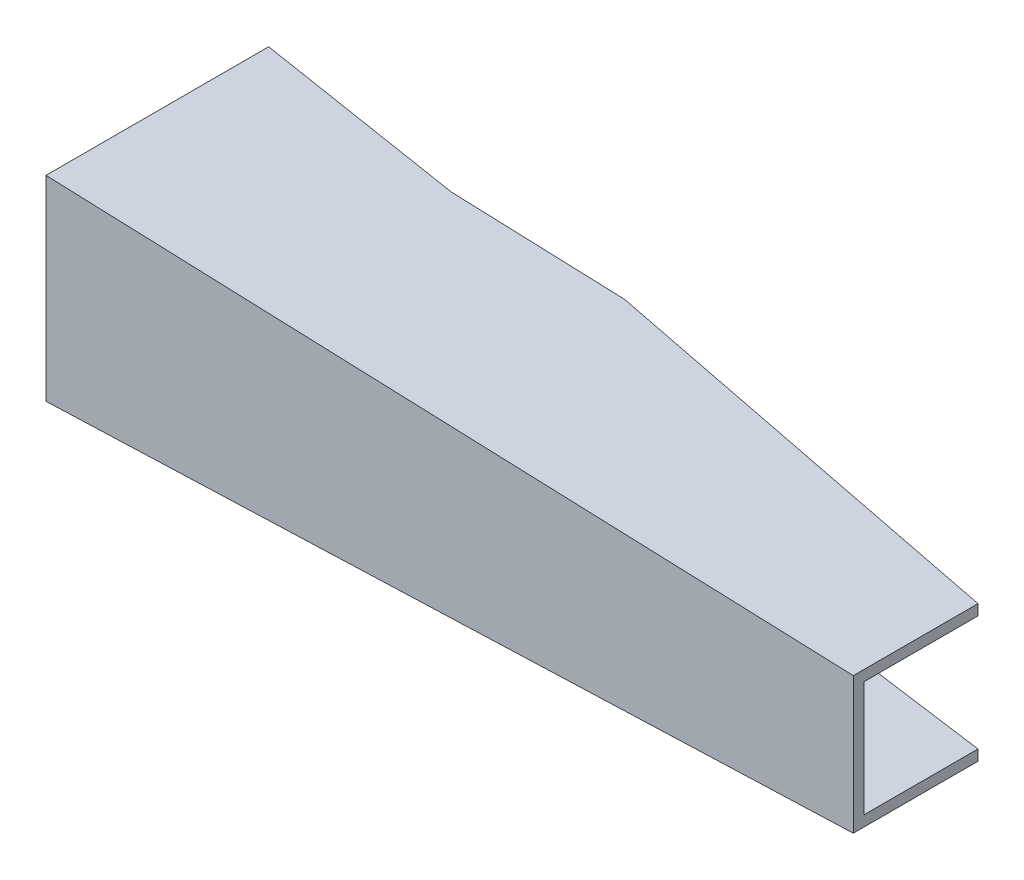
ISO-10303-21;
HEADER;
FILE_DESCRIPTION(('STEP AP214'),'2;1');
FILE_NAME('part.step','',(''),(''),'','','');
FILE_SCHEMA(('AUTOMOTIVE_DESIGN { 1 0 10303 214 1 1 1 1 }'));
ENDSEC;
DATA;
#1=APPLICATION_CONTEXT('core data for automotive mechanical design processes');
#2=APPLICATION_PROTOCOL_DEFINITION('international standard','automotive_design',2000,#1);
#3=PRODUCT_CONTEXT('',#1,'mechanical');
#4=PRODUCT('Part','Part','',(#3));
#5=PRODUCT_RELATED_PRODUCT_CATEGORY('part','',(#4));
#6=PRODUCT_DEFINITION_FORMATION('','',#4);
#7=PRODUCT_DEFINITION_CONTEXT('part definition',#1,'design');
#8=PRODUCT_DEFINITION('design','',#6,#7);
#9=PRODUCT_DEFINITION_SHAPE('','',#8);
#10=(LENGTH_UNIT() NAMED_UNIT(*) SI_UNIT(.MILLI.,.METRE.));
#11=(NAMED_UNIT(*) PLANE_ANGLE_UNIT() SI_UNIT($,.RADIAN.));
#12=(NAMED_UNIT(*) SI_UNIT($,.STERADIAN.) SOLID_ANGLE_UNIT());
#13=UNCERTAINTY_MEASURE_WITH_UNIT(LENGTH_MEASURE(1.E-05),#10,'distance_accuracy_value','');
#14=(GEOMETRIC_REPRESENTATION_CONTEXT(3) GLOBAL_UNCERTAINTY_ASSIGNED_CONTEXT((#13)) GLOBAL_UNIT_ASSIGNED_CONTEXT((#10,
#11,#12)) REPRESENTATION_CONTEXT('',''));
#15=CARTESIAN_POINT('',(0.,0.,0.));
#16=DIRECTION('',(0.,0.,1.));
#17=DIRECTION('',(1.,0.,0.));
#18=AXIS2_PLACEMENT_3D('',#15,#16,#17);
#19=CARTESIAN_POINT('',(326.3,-27.585,105.));
#20=DIRECTION('',(-1.,0.,0.));
#21=DIRECTION('',(0.,0.,1.));
#22=AXIS2_PLACEMENT_3D('',#19,#20,#21);
#23=PLANE('',#22);
#24=DIRECTION('',(0.,0.,1.));
#25=VECTOR('',#24,1.);
#26=CARTESIAN_POINT('',(326.3,23.285,100.7));
#27=LINE('',#26,#25);
#28=CARTESIAN_POINT('',(326.3,23.285,54.6));
#29=VERTEX_POINT('',#28);
#30=CARTESIAN_POINT('',(326.3,23.285,100.7));
#31=VERTEX_POINT('',#30);
#32=EDGE_CURVE('E138',#29,#31,#27,.T.);
#33=ORIENTED_EDGE('',*,*,#32,.F.);
#34=DIRECTION('',(0.,-1.,0.));
#35=VECTOR('',#34,1.);
#36=CARTESIAN_POINT('',(326.3,105.1,54.6));
#37=LINE('',#36,#35);
#38=CARTESIAN_POINT('',(326.3,27.585,54.6));
#39=VERTEX_POINT('',#38);
#40=EDGE_CURVE('E244',#39,#29,#37,.T.);
#41=ORIENTED_EDGE('',*,*,#40,.F.);
#42=DIRECTION('',(0.,0.,-1.));
#43=VECTOR('',#42,1.);
#44=CARTESIAN_POINT('',(326.3,27.585,105.));
#45=LINE('',#44,#43);
#46=CARTESIAN_POINT('',(326.3,27.585,105.));
#47=VERTEX_POINT('',#46);
#48=EDGE_CURVE('E229',#47,#39,#45,.T.);
#49=ORIENTED_EDGE('',*,*,#48,.F.);
#50=DIRECTION('',(0.,1.,0.));
#51=VECTOR('',#50,1.);
#52=CARTESIAN_POINT('',(326.3,-27.585,105.));
#53=LINE('',#52,#51);
#54=CARTESIAN_POINT('',(326.3,-27.585,105.));
#55=VERTEX_POINT('',#54);
#56=EDGE_CURVE('E204',#55,#47,#53,.T.);
#57=ORIENTED_EDGE('',*,*,#56,.F.);
#58=DIRECTION('',(0.,0.,-1.));
#59=VECTOR('',#58,1.);
#60=CARTESIAN_POINT('',(326.3,-27.585,105.));
#61=LINE('',#60,#59);
#62=CARTESIAN_POINT('',(326.3,-27.585,54.6));
#63=VERTEX_POINT('',#62);
#64=EDGE_CURVE('E217',#55,#63,#61,.T.);
#65=ORIENTED_EDGE('',*,*,#64,.T.);
#66=CARTESIAN_POINT('',(326.3,-23.285,54.6));
#67=VERTEX_POINT('',#66);
#68=EDGE_CURVE('E71',#67,#63,#37,.T.);
#69=ORIENTED_EDGE('',*,*,#68,.F.);
#70=DIRECTION('',(0.,0.,-1.));
#71=VECTOR('',#70,1.);
#72=CARTESIAN_POINT('',(326.3,-23.285,100.7));
#73=LINE('',#72,#71);
#74=CARTESIAN_POINT('',(326.3,-23.285,100.7));
#75=VERTEX_POINT('',#74);
#76=EDGE_CURVE('E64',#75,#67,#73,.T.);
#77=ORIENTED_EDGE('',*,*,#76,.F.);
#78=DIRECTION('',(0.,-1.,0.));
#79=VECTOR('',#78,1.);
#80=CARTESIAN_POINT('',(326.3,23.285,100.7));
#81=LINE('',#80,#79);
#82=EDGE_CURVE('E152',#31,#75,#81,.T.);
#83=ORIENTED_EDGE('',*,*,#82,.F.);
#84=EDGE_LOOP('',(#33,#41,#49,#57,#65,#69,#77,#83));
#85=FACE_BOUND('',#84,.T.);
#86=ADVANCED_FACE('F47',(#85),#23,.F.);
#87=CARTESIAN_POINT('',(0.,39.555,105.));
#88=DIRECTION('',(1.,0.,0.));
#89=DIRECTION('',(0.,1.,0.));
#90=AXIS2_PLACEMENT_3D('',#87,#88,#89);
#91=PLANE('',#90);
#92=DIRECTION('',(0.,0.,-1.));
#93=VECTOR('',#92,1.);
#94=CARTESIAN_POINT('',(0.,35.255,-10.9565275072));
#95=LINE('',#94,#93);
#96=CARTESIAN_POINT('',(0.,35.255,100.7));
#97=VERTEX_POINT('',#96);
#98=CARTESIAN_POINT('',(0.,35.255,15.));
#99=VERTEX_POINT('',#98);
#100=EDGE_CURVE('E170',#97,#99,#95,.T.);
#101=ORIENTED_EDGE('',*,*,#100,.F.);
#102=DIRECTION('',(0.,1.,0.));
#103=VECTOR('',#102,1.);
#104=CARTESIAN_POINT('',(0.,35.255,100.7));
#105=LINE('',#104,#103);
#106=CARTESIAN_POINT('',(0.,-35.255,100.7));
#107=VERTEX_POINT('',#106);
#108=EDGE_CURVE('E154',#107,#97,#105,.T.);
#109=ORIENTED_EDGE('',*,*,#108,.F.);
#110=DIRECTION('',(0.,0.,1.));
#111=VECTOR('',#110,1.);
#112=CARTESIAN_POINT('',(0.,-35.255,-10.9565275072));
#113=LINE('',#112,#111);
#114=CARTESIAN_POINT('',(0.,-35.255,15.));
#115=VERTEX_POINT('',#114);
#116=EDGE_CURVE('E178',#115,#107,#113,.T.);
#117=ORIENTED_EDGE('',*,*,#116,.F.);
#118=DIRECTION('',(0.,-1.,0.));
#119=VECTOR('',#118,1.);
#120=CARTESIAN_POINT('',(0.,105.1,15.));
#121=LINE('',#120,#119);
#122=CARTESIAN_POINT('',(0.,-39.555,15.));
#123=VERTEX_POINT('',#122);
#124=EDGE_CURVE('E183',#115,#123,#121,.T.);
#125=ORIENTED_EDGE('',*,*,#124,.T.);
#126=DIRECTION('',(0.,0.,-1.));
#127=VECTOR('',#126,1.);
#128=CARTESIAN_POINT('',(0.,-39.555,105.));
#129=LINE('',#128,#127);
#130=CARTESIAN_POINT('',(0.,-39.555,105.));
#131=VERTEX_POINT('',#130);
#132=EDGE_CURVE('E221',#131,#123,#129,.T.);
#133=ORIENTED_EDGE('',*,*,#132,.F.);
#134=DIRECTION('',(0.,-1.,0.));
#135=VECTOR('',#134,1.);
#136=CARTESIAN_POINT('',(0.,39.555,105.));
#137=LINE('',#136,#135);
#138=CARTESIAN_POINT('',(0.,39.555,105.));
#139=VERTEX_POINT('',#138);
#140=EDGE_CURVE('E211',#139,#131,#137,.T.);
#141=ORIENTED_EDGE('',*,*,#140,.F.);
#142=DIRECTION('',(0.,0.,-1.));
#143=VECTOR('',#142,1.);
#144=CARTESIAN_POINT('',(0.,39.555,105.));
#145=LINE('',#144,#143);
#146=CARTESIAN_POINT('',(0.,39.555,15.));
#147=VERTEX_POINT('',#146);
#148=EDGE_CURVE('E225',#139,#147,#145,.T.);
#149=ORIENTED_EDGE('',*,*,#148,.T.);
#150=EDGE_CURVE('E187',#147,#99,#121,.T.);
#151=ORIENTED_EDGE('',*,*,#150,.T.);
#152=EDGE_LOOP('',(#101,#109,#117,#125,#133,#141,#149,#151));
#153=FACE_BOUND('',#152,.T.);
#154=ADVANCED_FACE('F304',(#153),#91,.F.);
#155=CARTESIAN_POINT('',(0.,105.1,15.));
#156=DIRECTION('',(0.126715247143414,0.,-0.991939134292716));
#157=DIRECTION('',(-0.991939134292716,0.,-0.126715247143414));
#158=AXIS2_PLACEMENT_3D('',#155,#156,#157);
#159=PLANE('',#158);
#160=DIRECTION('',(0.,-1.,0.));
#161=VECTOR('',#160,1.);
#162=CARTESIAN_POINT('',(84.7,105.1,25.82));
#163=LINE('',#162,#161);
#164=CARTESIAN_POINT('',(84.7,36.4478623965676,25.82));
#165=VERTEX_POINT('',#164);
#166=CARTESIAN_POINT('',(84.7,32.1478623965676,25.82));
#167=VERTEX_POINT('',#166);
#168=EDGE_CURVE('E188',#165,#167,#163,.T.);
#169=ORIENTED_EDGE('',*,*,#168,.T.);
#170=DIRECTION('',(-0.991283067279321,0.036364260849934,-0.126631437874407));
#171=VECTOR('',#170,1.);
#172=CARTESIAN_POINT('',(-2.51772199464138,35.3473601969839,14.6783736483823));
#173=LINE('',#172,#171);
#174=EDGE_CURVE('E288',#167,#99,#173,.T.);
#175=ORIENTED_EDGE('',*,*,#174,.T.);
#176=ORIENTED_EDGE('',*,*,#150,.F.);
#177=DIRECTION('',(0.991283067279321,-0.036364260849934,0.126631437874407));
#178=VECTOR('',#177,1.);
#179=CARTESIAN_POINT('',(332.365093492241,27.3625079095859,57.4579729821257));
#180=LINE('',#179,#178);
#181=EDGE_CURVE('E201',#147,#165,#180,.T.);
#182=ORIENTED_EDGE('',*,*,#181,.T.);
#183=EDGE_LOOP('',(#169,#175,#176,#182));
#184=FACE_BOUND('',#183,.T.);
#185=ADVANCED_FACE('F300',(#184),#159,.T.);
#186=ORIENTED_EDGE('',*,*,#124,.F.);
#187=DIRECTION('',(0.991283067279321,0.036364260849934,0.126631437874407));
#188=VECTOR('',#187,1.);
#189=CARTESIAN_POINT('',(5.05941542784582,-35.0694002369865,15.6463149342301));
#190=LINE('',#189,#188);
#191=CARTESIAN_POINT('',(84.7,-32.1478623965676,25.82));
#192=VERTEX_POINT('',#191);
#193=EDGE_CURVE('E281',#115,#192,#190,.T.);
#194=ORIENTED_EDGE('',*,*,#193,.T.);
#195=CARTESIAN_POINT('',(84.7,-36.4478623965676,25.82));
#196=VERTEX_POINT('',#195);
#197=EDGE_CURVE('E258',#192,#196,#163,.T.);
#198=ORIENTED_EDGE('',*,*,#197,.T.);
#199=DIRECTION('',(-0.991283067279321,-0.036364260849934,-0.126631437874407));
#200=VECTOR('',#199,1.);
#201=CARTESIAN_POINT('',(11.297484013512,-39.14056272252,16.4431968952326));
#202=LINE('',#201,#200);
#203=EDGE_CURVE('E240',#196,#123,#202,.T.);
#204=ORIENTED_EDGE('',*,*,#203,.T.);
#205=EDGE_LOOP('',(#186,#194,#198,#204));
#206=FACE_BOUND('',#205,.T.);
#207=ADVANCED_FACE('F279',(#206),#159,.T.);
#208=CARTESIAN_POINT('',(84.7,105.1,25.82));
#209=DIRECTION('',(0.,0.,-1.));
#210=DIRECTION('',(-1.,0.,0.));
#211=AXIS2_PLACEMENT_3D('',#208,#209,#210);
#212=PLANE('',#211);
#213=DIRECTION('',(0.,-1.,0.));
#214=VECTOR('',#213,1.);
#215=CARTESIAN_POINT('',(154.7,105.1,25.82));
#216=LINE('',#215,#214);
#217=CARTESIAN_POINT('',(154.7,33.8799800796813,25.82));
#218=VERTEX_POINT('',#217);
#219=CARTESIAN_POINT('',(154.7,29.5799800796813,25.82));
#220=VERTEX_POINT('',#219);
#221=EDGE_CURVE('E254',#218,#220,#216,.T.);
#222=ORIENTED_EDGE('',*,*,#221,.T.);
#223=DIRECTION('',(-0.999327819206277,0.0366593747958907,0.));
#224=VECTOR('',#223,1.);
#225=CARTESIAN_POINT('',(82.0274179121405,32.2459034863367,25.82));
#226=LINE('',#225,#224);
#227=EDGE_CURVE('E284',#220,#167,#226,.T.);
#228=ORIENTED_EDGE('',*,*,#227,.T.);
#229=ORIENTED_EDGE('',*,*,#168,.F.);
#230=DIRECTION('',(0.999327819206278,-0.0366593747958907,0.));
#231=VECTOR('',#230,1.);
#232=CARTESIAN_POINT('',(326.3,27.585,25.82));
#233=LINE('',#232,#231);
#234=EDGE_CURVE('E198',#165,#218,#233,.T.);
#235=ORIENTED_EDGE('',*,*,#234,.T.);
#236=EDGE_LOOP('',(#222,#228,#229,#235));
#237=FACE_BOUND('',#236,.T.);
#238=ADVANCED_FACE('F351',(#237),#212,.T.);
#239=ORIENTED_EDGE('',*,*,#197,.F.);
#240=DIRECTION('',(0.999327819206278,0.0366593747958907,0.));
#241=VECTOR('',#240,1.);
#242=CARTESIAN_POINT('',(89.7280388030852,-31.9634136546953,25.82));
#243=LINE('',#242,#241);
#244=CARTESIAN_POINT('',(154.7,-29.5799800796813,25.82));
#245=VERTEX_POINT('',#244);
#246=EDGE_CURVE('E173',#192,#245,#243,.T.);
#247=ORIENTED_EDGE('',*,*,#246,.T.);
#248=CARTESIAN_POINT('',(154.7,-33.8799800796813,25.82));
#249=VERTEX_POINT('',#248);
#250=EDGE_CURVE('E248',#245,#249,#216,.T.);
#251=ORIENTED_EDGE('',*,*,#250,.T.);
#252=DIRECTION('',(-0.999327819206278,-0.0366593747958907,0.));
#253=VECTOR('',#252,1.);
#254=CARTESIAN_POINT('',(0.,-39.555,25.82));
#255=LINE('',#254,#253);
#256=EDGE_CURVE('E236',#249,#196,#255,.T.);
#257=ORIENTED_EDGE('',*,*,#256,.T.);
#258=EDGE_LOOP('',(#239,#247,#251,#257));
#259=FACE_BOUND('',#258,.T.);
#260=ADVANCED_FACE('F268',(#259),#212,.T.);
#261=CARTESIAN_POINT('',(154.7,105.1,25.82));
#262=DIRECTION('',(0.165405444621505,0.,-0.986225653128919));
#263=DIRECTION('',(-0.986225653128919,0.,-0.165405444621505));
#264=AXIS2_PLACEMENT_3D('',#261,#262,#263);
#265=PLANE('',#264);
#266=ORIENTED_EDGE('',*,*,#40,.T.);
#267=DIRECTION('',(-0.985580850259129,0.0361550805320312,-0.165297301109894));
#268=VECTOR('',#267,1.);
#269=CARTESIAN_POINT('',(152.008938111662,29.6786990830628,25.3686668930864));
#270=LINE('',#269,#268);
#271=EDGE_CURVE('E12',#29,#220,#270,.T.);
#272=ORIENTED_EDGE('',*,*,#271,.T.);
#273=ORIENTED_EDGE('',*,*,#221,.F.);
#274=DIRECTION('',(0.985580850259129,-0.0361550805320312,0.165297301109894));
#275=VECTOR('',#274,1.);
#276=CARTESIAN_POINT('',(334.510858270501,27.2837926034389,55.9770891668124));
#277=LINE('',#276,#275);
#278=EDGE_CURVE('E194',#218,#39,#277,.T.);
#279=ORIENTED_EDGE('',*,*,#278,.T.);
#280=EDGE_LOOP('',(#266,#272,#273,#279));
#281=FACE_BOUND('',#280,.T.);
#282=ADVANCED_FACE('F348',(#281),#265,.T.);
#283=ORIENTED_EDGE('',*,*,#250,.F.);
#284=DIRECTION('',(0.985580850259129,0.0361550805320312,0.165297301109894));
#285=VECTOR('',#284,1.);
#286=CARTESIAN_POINT('',(159.499153415173,-29.4039277769549,26.6248929795378));
#287=LINE('',#286,#285);
#288=EDGE_CURVE('E56',#245,#67,#287,.T.);
#289=ORIENTED_EDGE('',*,*,#288,.T.);
#290=ORIENTED_EDGE('',*,*,#68,.T.);
#291=DIRECTION('',(-0.985580850259129,-0.0361550805320312,-0.165297301109894));
#292=VECTOR('',#291,1.);
#293=CARTESIAN_POINT('',(17.1264176977011,-38.9267339263209,2.74676166281956));
#294=LINE('',#293,#292);
#295=EDGE_CURVE('E233',#63,#249,#294,.T.);
#296=ORIENTED_EDGE('',*,*,#295,.T.);
#297=EDGE_LOOP('',(#283,#289,#290,#296));
#298=FACE_BOUND('',#297,.T.);
#299=ADVANCED_FACE('F271',(#298),#265,.T.);
#300=CARTESIAN_POINT('',(326.3,27.585,105.));
#301=DIRECTION('',(-0.0366593747958907,-0.999327819206278,0.));
#302=DIRECTION('',(0.999327819206278,-0.0366593747958907,0.));
#303=AXIS2_PLACEMENT_3D('',#300,#301,#302);
#304=PLANE('',#303);
#305=ORIENTED_EDGE('',*,*,#181,.F.);
#306=ORIENTED_EDGE('',*,*,#148,.F.);
#307=DIRECTION('',(-0.999327819206278,0.0366593747958907,0.));
#308=VECTOR('',#307,1.);
#309=CARTESIAN_POINT('',(326.3,27.585,105.));
#310=LINE('',#309,#308);
#311=EDGE_CURVE('E208',#47,#139,#310,.T.);
#312=ORIENTED_EDGE('',*,*,#311,.F.);
#313=ORIENTED_EDGE('',*,*,#48,.T.);
#314=ORIENTED_EDGE('',*,*,#278,.F.);
#315=ORIENTED_EDGE('',*,*,#234,.F.);
#316=EDGE_LOOP('',(#305,#306,#312,#313,#314,#315));
#317=FACE_BOUND('',#316,.T.);
#318=ADVANCED_FACE('F341',(#317),#304,.F.);
#319=CARTESIAN_POINT('',(0.,-39.555,105.));
#320=DIRECTION('',(-0.0366593747958907,0.999327819206278,0.));
#321=DIRECTION('',(-0.999327819206278,-0.0366593747958907,0.));
#322=AXIS2_PLACEMENT_3D('',#319,#320,#321);
#323=PLANE('',#322);
#324=ORIENTED_EDGE('',*,*,#203,.F.);
#325=ORIENTED_EDGE('',*,*,#256,.F.);
#326=ORIENTED_EDGE('',*,*,#295,.F.);
#327=ORIENTED_EDGE('',*,*,#64,.F.);
#328=DIRECTION('',(0.999327819206278,0.0366593747958907,0.));
#329=VECTOR('',#328,1.);
#330=CARTESIAN_POINT('',(0.,-39.555,105.));
#331=LINE('',#330,#329);
#332=EDGE_CURVE('E214',#131,#55,#331,.T.);
#333=ORIENTED_EDGE('',*,*,#332,.F.);
#334=ORIENTED_EDGE('',*,*,#132,.T.);
#335=EDGE_LOOP('',(#324,#325,#326,#327,#333,#334));
#336=FACE_BOUND('',#335,.T.);
#337=ADVANCED_FACE('F274',(#336),#323,.F.);
#338=CARTESIAN_POINT('',(0.,0.,105.));
#339=DIRECTION('',(0.,0.,1.));
#340=DIRECTION('',(1.,0.,0.));
#341=AXIS2_PLACEMENT_3D('',#338,#339,#340);
#342=PLANE('',#341);
#343=ORIENTED_EDGE('',*,*,#56,.T.);
#344=ORIENTED_EDGE('',*,*,#311,.T.);
#345=ORIENTED_EDGE('',*,*,#140,.T.);
#346=ORIENTED_EDGE('',*,*,#332,.T.);
#347=EDGE_LOOP('',(#343,#344,#345,#346));
#348=FACE_BOUND('',#347,.T.);
#349=ADVANCED_FACE('F316',(#348),#342,.T.);
#350=CARTESIAN_POINT('',(1.29155751432091,35.2076204613962,0.));
#351=DIRECTION('',(-0.0366593747958907,-0.999327819206277,0.));
#352=DIRECTION('',(0.999327819206277,-0.0366593747958907,0.));
#353=AXIS2_PLACEMENT_3D('',#350,#351,#352);
#354=PLANE('',#353);
#355=ORIENTED_EDGE('',*,*,#227,.F.);
#356=ORIENTED_EDGE('',*,*,#271,.F.);
#357=ORIENTED_EDGE('',*,*,#32,.T.);
#358=DIRECTION('',(-0.999327819206278,0.0366593747958907,0.));
#359=VECTOR('',#358,1.);
#360=CARTESIAN_POINT('',(326.3,23.285,100.7));
#361=LINE('',#360,#359);
#362=EDGE_CURVE('E141',#31,#97,#361,.T.);
#363=ORIENTED_EDGE('',*,*,#362,.T.);
#364=ORIENTED_EDGE('',*,*,#100,.T.);
#365=ORIENTED_EDGE('',*,*,#174,.F.);
#366=EDGE_LOOP('',(#355,#356,#357,#363,#364,#365));
#367=FACE_BOUND('',#366,.T.);
#368=ADVANCED_FACE('F140',(#367),#354,.T.);
#369=CARTESIAN_POINT('',(0.,0.,100.7));
#370=DIRECTION('',(0.,0.,-1.));
#371=DIRECTION('',(0.,1.,0.));
#372=AXIS2_PLACEMENT_3D('',#369,#370,#371);
#373=PLANE('',#372);
#374=ORIENTED_EDGE('',*,*,#362,.F.);
#375=ORIENTED_EDGE('',*,*,#82,.T.);
#376=DIRECTION('',(-0.999327819206278,-0.0366593747958907,0.));
#377=VECTOR('',#376,1.);
#378=CARTESIAN_POINT('',(326.3,-23.285,100.7));
#379=LINE('',#378,#377);
#380=EDGE_CURVE('E157',#75,#107,#379,.T.);
#381=ORIENTED_EDGE('',*,*,#380,.T.);
#382=ORIENTED_EDGE('',*,*,#108,.T.);
#383=EDGE_LOOP('',(#374,#375,#381,#382));
#384=FACE_BOUND('',#383,.T.);
#385=ADVANCED_FACE('F150',(#384),#373,.T.);
#386=CARTESIAN_POINT('',(1.29155751432091,-35.2076204613962,0.));
#387=DIRECTION('',(-0.0366593747958907,0.999327819206278,0.));
#388=DIRECTION('',(-0.999327819206278,-0.0366593747958907,0.));
#389=AXIS2_PLACEMENT_3D('',#386,#387,#388);
#390=PLANE('',#389);
#391=ORIENTED_EDGE('',*,*,#116,.T.);
#392=ORIENTED_EDGE('',*,*,#380,.F.);
#393=ORIENTED_EDGE('',*,*,#76,.T.);
#394=ORIENTED_EDGE('',*,*,#288,.F.);
#395=ORIENTED_EDGE('',*,*,#246,.F.);
#396=ORIENTED_EDGE('',*,*,#193,.F.);
#397=EDGE_LOOP('',(#391,#392,#393,#394,#395,#396));
#398=FACE_BOUND('',#397,.T.);
#399=ADVANCED_FACE('F317',(#398),#390,.T.);
#400=CLOSED_SHELL('',(#86,#154,#185,#207,#238,#260,#282,#299,#318,#337,#349,#368,#385,#399));
#401=MANIFOLD_SOLID_BREP('B2',#400);
#402=ADVANCED_BREP_SHAPE_REPRESENTATION('',(#18,#401),#14);
#403=SHAPE_DEFINITION_REPRESENTATION(#9,#402);
ENDSEC;
END-ISO-10303-21;
